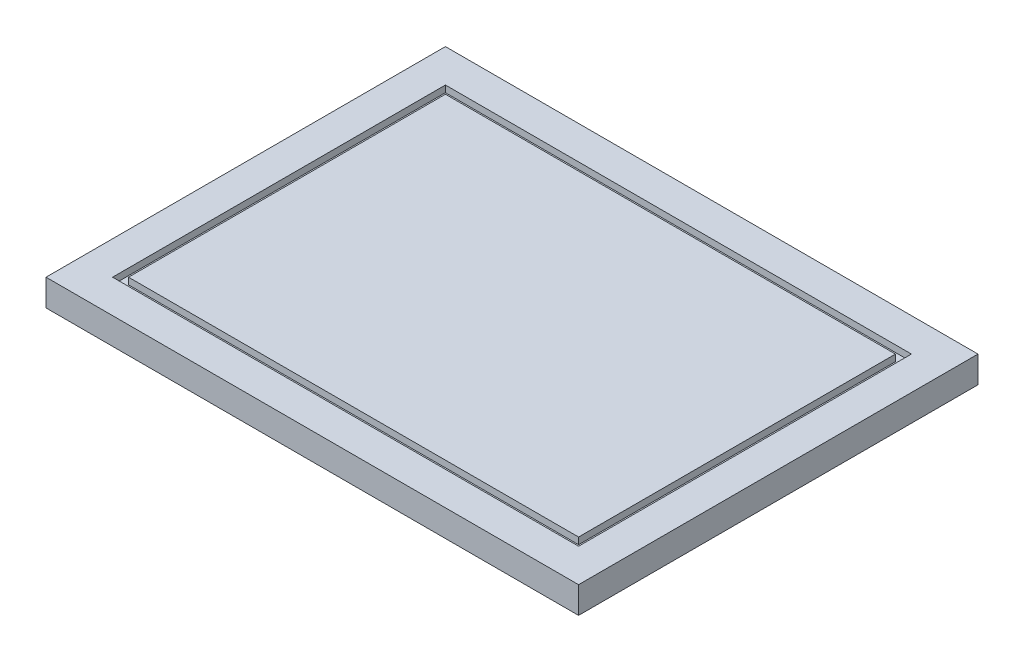
ISO-10303-21;
HEADER;
FILE_DESCRIPTION(('STEP AP214'),'2;1');
FILE_NAME('part.step','',(''),(''),'','','');
FILE_SCHEMA(('AUTOMOTIVE_DESIGN { 1 0 10303 214 1 1 1 1 }'));
ENDSEC;
DATA;
#1=APPLICATION_CONTEXT('core data for automotive mechanical design processes');
#2=APPLICATION_PROTOCOL_DEFINITION('international standard','automotive_design',2000,#1);
#3=PRODUCT_CONTEXT('',#1,'mechanical');
#4=PRODUCT('Part','Part','',(#3));
#5=PRODUCT_RELATED_PRODUCT_CATEGORY('part','',(#4));
#6=PRODUCT_DEFINITION_FORMATION('','',#4);
#7=PRODUCT_DEFINITION_CONTEXT('part definition',#1,'design');
#8=PRODUCT_DEFINITION('design','',#6,#7);
#9=PRODUCT_DEFINITION_SHAPE('','',#8);
#10=(LENGTH_UNIT() NAMED_UNIT(*) SI_UNIT(.MILLI.,.METRE.));
#11=(NAMED_UNIT(*) PLANE_ANGLE_UNIT() SI_UNIT($,.RADIAN.));
#12=(NAMED_UNIT(*) SI_UNIT($,.STERADIAN.) SOLID_ANGLE_UNIT());
#13=UNCERTAINTY_MEASURE_WITH_UNIT(LENGTH_MEASURE(1.E-05),#10,'distance_accuracy_value','');
#14=(GEOMETRIC_REPRESENTATION_CONTEXT(3) GLOBAL_UNCERTAINTY_ASSIGNED_CONTEXT((#13)) GLOBAL_UNIT_ASSIGNED_CONTEXT((#10,
#11,#12)) REPRESENTATION_CONTEXT('',''));
#15=CARTESIAN_POINT('',(0.,0.,0.));
#16=DIRECTION('',(0.,0.,1.));
#17=DIRECTION('',(1.,0.,0.));
#18=AXIS2_PLACEMENT_3D('',#15,#16,#17);
#19=CARTESIAN_POINT('',(0.,20.,0.));
#20=DIRECTION('',(1.,0.,0.));
#21=DIRECTION('',(0.,0.,-1.));
#22=AXIS2_PLACEMENT_3D('',#19,#20,#21);
#23=PLANE('',#22);
#24=DIRECTION('',(0.,0.,1.));
#25=VECTOR('',#24,1.);
#26=CARTESIAN_POINT('',(0.,0.,0.));
#27=LINE('',#26,#25);
#28=CARTESIAN_POINT('',(0.,0.,-300.));
#29=VERTEX_POINT('',#28);
#30=CARTESIAN_POINT('',(0.,0.,0.));
#31=VERTEX_POINT('',#30);
#32=EDGE_CURVE('E189',#29,#31,#27,.T.);
#33=ORIENTED_EDGE('',*,*,#32,.T.);
#34=DIRECTION('',(0.,-1.,0.));
#35=VECTOR('',#34,1.);
#36=CARTESIAN_POINT('',(0.,20.,0.));
#37=LINE('',#36,#35);
#38=CARTESIAN_POINT('',(0.,20.,0.));
#39=VERTEX_POINT('',#38);
#40=EDGE_CURVE('E12',#39,#31,#37,.T.);
#41=ORIENTED_EDGE('',*,*,#40,.F.);
#42=DIRECTION('',(0.,0.,1.));
#43=VECTOR('',#42,1.);
#44=CARTESIAN_POINT('',(0.,20.,0.));
#45=LINE('',#44,#43);
#46=CARTESIAN_POINT('',(0.,20.,-300.));
#47=VERTEX_POINT('',#46);
#48=EDGE_CURVE('E194',#47,#39,#45,.T.);
#49=ORIENTED_EDGE('',*,*,#48,.F.);
#50=DIRECTION('',(0.,-1.,0.));
#51=VECTOR('',#50,1.);
#52=CARTESIAN_POINT('',(0.,20.,-300.));
#53=LINE('',#52,#51);
#54=EDGE_CURVE('E206',#47,#29,#53,.T.);
#55=ORIENTED_EDGE('',*,*,#54,.T.);
#56=EDGE_LOOP('',(#33,#41,#49,#55));
#57=FACE_BOUND('',#56,.T.);
#58=ADVANCED_FACE('F35',(#57),#23,.F.);
#59=CARTESIAN_POINT('',(0.,20.,0.));
#60=DIRECTION('',(0.,0.,-1.));
#61=DIRECTION('',(-1.,0.,0.));
#62=AXIS2_PLACEMENT_3D('',#59,#60,#61);
#63=PLANE('',#62);
#64=DIRECTION('',(1.,0.,0.));
#65=VECTOR('',#64,1.);
#66=CARTESIAN_POINT('',(0.,0.,0.));
#67=LINE('',#66,#65);
#68=CARTESIAN_POINT('',(400.,0.,0.));
#69=VERTEX_POINT('',#68);
#70=EDGE_CURVE('E209',#31,#69,#67,.T.);
#71=ORIENTED_EDGE('',*,*,#70,.T.);
#72=DIRECTION('',(0.,-1.,0.));
#73=VECTOR('',#72,1.);
#74=CARTESIAN_POINT('',(400.,20.,0.));
#75=LINE('',#74,#73);
#76=CARTESIAN_POINT('',(400.,20.,0.));
#77=VERTEX_POINT('',#76);
#78=EDGE_CURVE('E42',#77,#69,#75,.T.);
#79=ORIENTED_EDGE('',*,*,#78,.F.);
#80=DIRECTION('',(1.,0.,0.));
#81=VECTOR('',#80,1.);
#82=CARTESIAN_POINT('',(0.,20.,0.));
#83=LINE('',#82,#81);
#84=EDGE_CURVE('E198',#39,#77,#83,.T.);
#85=ORIENTED_EDGE('',*,*,#84,.F.);
#86=ORIENTED_EDGE('',*,*,#40,.T.);
#87=EDGE_LOOP('',(#71,#79,#85,#86));
#88=FACE_BOUND('',#87,.T.);
#89=ADVANCED_FACE('F239',(#88),#63,.F.);
#90=CARTESIAN_POINT('',(400.,20.,0.));
#91=DIRECTION('',(-1.,0.,0.));
#92=DIRECTION('',(0.,0.,1.));
#93=AXIS2_PLACEMENT_3D('',#90,#91,#92);
#94=PLANE('',#93);
#95=DIRECTION('',(0.,0.,-1.));
#96=VECTOR('',#95,1.);
#97=CARTESIAN_POINT('',(400.,0.,0.));
#98=LINE('',#97,#96);
#99=CARTESIAN_POINT('',(400.,0.,-300.));
#100=VERTEX_POINT('',#99);
#101=EDGE_CURVE('E211',#69,#100,#98,.T.);
#102=ORIENTED_EDGE('',*,*,#101,.T.);
#103=DIRECTION('',(0.,-1.,0.));
#104=VECTOR('',#103,1.);
#105=CARTESIAN_POINT('',(400.,20.,-300.));
#106=LINE('',#105,#104);
#107=CARTESIAN_POINT('',(400.,20.,-300.));
#108=VERTEX_POINT('',#107);
#109=EDGE_CURVE('E216',#108,#100,#106,.T.);
#110=ORIENTED_EDGE('',*,*,#109,.F.);
#111=DIRECTION('',(0.,0.,-1.));
#112=VECTOR('',#111,1.);
#113=CARTESIAN_POINT('',(400.,20.,0.));
#114=LINE('',#113,#112);
#115=EDGE_CURVE('E202',#77,#108,#114,.T.);
#116=ORIENTED_EDGE('',*,*,#115,.F.);
#117=ORIENTED_EDGE('',*,*,#78,.T.);
#118=EDGE_LOOP('',(#102,#110,#116,#117));
#119=FACE_BOUND('',#118,.T.);
#120=ADVANCED_FACE('F223',(#119),#94,.F.);
#121=CARTESIAN_POINT('',(0.,20.,-300.));
#122=DIRECTION('',(0.,0.,1.));
#123=DIRECTION('',(1.,0.,0.));
#124=AXIS2_PLACEMENT_3D('',#121,#122,#123);
#125=PLANE('',#124);
#126=DIRECTION('',(-1.,0.,0.));
#127=VECTOR('',#126,1.);
#128=CARTESIAN_POINT('',(0.,0.,-300.));
#129=LINE('',#128,#127);
#130=EDGE_CURVE('E199',#100,#29,#129,.T.);
#131=ORIENTED_EDGE('',*,*,#130,.T.);
#132=ORIENTED_EDGE('',*,*,#54,.F.);
#133=DIRECTION('',(-1.,0.,0.));
#134=VECTOR('',#133,1.);
#135=CARTESIAN_POINT('',(0.,20.,-300.));
#136=LINE('',#135,#134);
#137=EDGE_CURVE('E204',#108,#47,#136,.T.);
#138=ORIENTED_EDGE('',*,*,#137,.F.);
#139=ORIENTED_EDGE('',*,*,#109,.T.);
#140=EDGE_LOOP('',(#131,#132,#138,#139));
#141=FACE_BOUND('',#140,.T.);
#142=ADVANCED_FACE('F232',(#141),#125,.F.);
#143=CARTESIAN_POINT('',(0.,20.,0.));
#144=DIRECTION('',(0.,-1.,0.));
#145=DIRECTION('',(0.,0.,-1.));
#146=AXIS2_PLACEMENT_3D('',#143,#144,#145);
#147=PLANE('',#146);
#148=DIRECTION('',(0.,0.,1.));
#149=VECTOR('',#148,1.);
#150=CARTESIAN_POINT('',(25.,20.,-275.));
#151=LINE('',#150,#149);
#152=CARTESIAN_POINT('',(25.,20.,-275.));
#153=VERTEX_POINT('',#152);
#154=CARTESIAN_POINT('',(25.0000000000001,20.,-24.9999999999999));
#155=VERTEX_POINT('',#154);
#156=EDGE_CURVE('E179',#153,#155,#151,.T.);
#157=ORIENTED_EDGE('',*,*,#156,.F.);
#158=DIRECTION('',(-1.,0.,0.));
#159=VECTOR('',#158,1.);
#160=CARTESIAN_POINT('',(375.,20.,-275.));
#161=LINE('',#160,#159);
#162=CARTESIAN_POINT('',(375.,20.,-275.));
#163=VERTEX_POINT('',#162);
#164=EDGE_CURVE('E49',#163,#153,#161,.T.);
#165=ORIENTED_EDGE('',*,*,#164,.F.);
#166=DIRECTION('',(0.,0.,-1.));
#167=VECTOR('',#166,1.);
#168=CARTESIAN_POINT('',(375.,20.,-24.9999999999999));
#169=LINE('',#168,#167);
#170=CARTESIAN_POINT('',(375.,20.,-24.9999999999999));
#171=VERTEX_POINT('',#170);
#172=EDGE_CURVE('E168',#171,#163,#169,.T.);
#173=ORIENTED_EDGE('',*,*,#172,.F.);
#174=DIRECTION('',(1.,0.,0.));
#175=VECTOR('',#174,1.);
#176=CARTESIAN_POINT('',(25.0000000000001,20.,-24.9999999999999));
#177=LINE('',#176,#175);
#178=EDGE_CURVE('E182',#155,#171,#177,.T.);
#179=ORIENTED_EDGE('',*,*,#178,.F.);
#180=EDGE_LOOP('',(#157,#165,#173,#179));
#181=FACE_BOUND('',#180,.T.);
#182=ORIENTED_EDGE('',*,*,#48,.T.);
#183=ORIENTED_EDGE('',*,*,#84,.T.);
#184=ORIENTED_EDGE('',*,*,#115,.T.);
#185=ORIENTED_EDGE('',*,*,#137,.T.);
#186=EDGE_LOOP('',(#182,#183,#184,#185));
#187=FACE_BOUND('',#186,.T.);
#188=ADVANCED_FACE('F238',(#181,#187),#147,.F.);
#189=CARTESIAN_POINT('',(0.,0.,0.));
#190=DIRECTION('',(0.,-1.,0.));
#191=DIRECTION('',(0.,0.,-1.));
#192=AXIS2_PLACEMENT_3D('',#189,#190,#191);
#193=PLANE('',#192);
#194=ORIENTED_EDGE('',*,*,#32,.F.);
#195=ORIENTED_EDGE('',*,*,#130,.F.);
#196=ORIENTED_EDGE('',*,*,#101,.F.);
#197=ORIENTED_EDGE('',*,*,#70,.F.);
#198=EDGE_LOOP('',(#194,#195,#196,#197));
#199=FACE_BOUND('',#198,.T.);
#200=ADVANCED_FACE('F229',(#199),#193,.T.);
#201=CARTESIAN_POINT('',(375.,15.,-275.));
#202=DIRECTION('',(0.,0.,-1.));
#203=DIRECTION('',(-1.,0.,0.));
#204=AXIS2_PLACEMENT_3D('',#201,#202,#203);
#205=PLANE('',#204);
#206=ORIENTED_EDGE('',*,*,#164,.T.);
#207=DIRECTION('',(0.,1.,0.));
#208=VECTOR('',#207,1.);
#209=CARTESIAN_POINT('',(25.,15.,-275.));
#210=LINE('',#209,#208);
#211=CARTESIAN_POINT('',(25.,15.,-275.));
#212=VERTEX_POINT('',#211);
#213=EDGE_CURVE('E177',#212,#153,#210,.T.);
#214=ORIENTED_EDGE('',*,*,#213,.F.);
#215=DIRECTION('',(-1.,0.,0.));
#216=VECTOR('',#215,1.);
#217=CARTESIAN_POINT('',(375.,15.,-275.));
#218=LINE('',#217,#216);
#219=CARTESIAN_POINT('',(375.,15.,-275.));
#220=VERTEX_POINT('',#219);
#221=EDGE_CURVE('E164',#220,#212,#218,.T.);
#222=ORIENTED_EDGE('',*,*,#221,.F.);
#223=DIRECTION('',(0.,1.,0.));
#224=VECTOR('',#223,1.);
#225=CARTESIAN_POINT('',(375.,15.,-275.));
#226=LINE('',#225,#224);
#227=EDGE_CURVE('E187',#220,#163,#226,.T.);
#228=ORIENTED_EDGE('',*,*,#227,.T.);
#229=EDGE_LOOP('',(#206,#214,#222,#228));
#230=FACE_BOUND('',#229,.T.);
#231=ADVANCED_FACE('F251',(#230),#205,.F.);
#232=CARTESIAN_POINT('',(375.,15.,-24.9999999999999));
#233=DIRECTION('',(1.,0.,0.));
#234=DIRECTION('',(0.,0.,-1.));
#235=AXIS2_PLACEMENT_3D('',#232,#233,#234);
#236=PLANE('',#235);
#237=ORIENTED_EDGE('',*,*,#172,.T.);
#238=ORIENTED_EDGE('',*,*,#227,.F.);
#239=DIRECTION('',(0.,0.,-1.));
#240=VECTOR('',#239,1.);
#241=CARTESIAN_POINT('',(375.,15.,-24.9999999999999));
#242=LINE('',#241,#240);
#243=CARTESIAN_POINT('',(375.,15.,-24.9999999999999));
#244=VERTEX_POINT('',#243);
#245=EDGE_CURVE('E174',#244,#220,#242,.T.);
#246=ORIENTED_EDGE('',*,*,#245,.F.);
#247=DIRECTION('',(0.,1.,0.));
#248=VECTOR('',#247,1.);
#249=CARTESIAN_POINT('',(375.,15.,-24.9999999999999));
#250=LINE('',#249,#248);
#251=EDGE_CURVE('E190',#244,#171,#250,.T.);
#252=ORIENTED_EDGE('',*,*,#251,.T.);
#253=EDGE_LOOP('',(#237,#238,#246,#252));
#254=FACE_BOUND('',#253,.T.);
#255=ADVANCED_FACE('F258',(#254),#236,.F.);
#256=CARTESIAN_POINT('',(25.0000000000001,15.,-24.9999999999999));
#257=DIRECTION('',(0.,0.,1.));
#258=DIRECTION('',(1.,0.,0.));
#259=AXIS2_PLACEMENT_3D('',#256,#257,#258);
#260=PLANE('',#259);
#261=ORIENTED_EDGE('',*,*,#178,.T.);
#262=ORIENTED_EDGE('',*,*,#251,.F.);
#263=DIRECTION('',(1.,0.,0.));
#264=VECTOR('',#263,1.);
#265=CARTESIAN_POINT('',(25.0000000000001,15.,-24.9999999999999));
#266=LINE('',#265,#264);
#267=CARTESIAN_POINT('',(25.0000000000001,15.,-24.9999999999999));
#268=VERTEX_POINT('',#267);
#269=EDGE_CURVE('E171',#268,#244,#266,.T.);
#270=ORIENTED_EDGE('',*,*,#269,.F.);
#271=DIRECTION('',(0.,1.,0.));
#272=VECTOR('',#271,1.);
#273=CARTESIAN_POINT('',(25.0000000000001,15.,-24.9999999999999));
#274=LINE('',#273,#272);
#275=EDGE_CURVE('E192',#268,#155,#274,.T.);
#276=ORIENTED_EDGE('',*,*,#275,.T.);
#277=EDGE_LOOP('',(#261,#262,#270,#276));
#278=FACE_BOUND('',#277,.T.);
#279=ADVANCED_FACE('F262',(#278),#260,.F.);
#280=CARTESIAN_POINT('',(25.,15.,-275.));
#281=DIRECTION('',(-1.,0.,0.));
#282=DIRECTION('',(0.,0.,1.));
#283=AXIS2_PLACEMENT_3D('',#280,#281,#282);
#284=PLANE('',#283);
#285=ORIENTED_EDGE('',*,*,#156,.T.);
#286=ORIENTED_EDGE('',*,*,#275,.F.);
#287=DIRECTION('',(0.,0.,1.));
#288=VECTOR('',#287,1.);
#289=CARTESIAN_POINT('',(25.,15.,-275.));
#290=LINE('',#289,#288);
#291=EDGE_CURVE('E167',#212,#268,#290,.T.);
#292=ORIENTED_EDGE('',*,*,#291,.F.);
#293=ORIENTED_EDGE('',*,*,#213,.T.);
#294=EDGE_LOOP('',(#285,#286,#292,#293));
#295=FACE_BOUND('',#294,.T.);
#296=ADVANCED_FACE('F259',(#295),#284,.F.);
#297=CARTESIAN_POINT('',(0.,15.,0.));
#298=DIRECTION('',(0.,1.,0.));
#299=DIRECTION('',(0.,0.,1.));
#300=AXIS2_PLACEMENT_3D('',#297,#298,#299);
#301=PLANE('',#300);
#302=DIRECTION('',(-1.,0.,0.));
#303=VECTOR('',#302,1.);
#304=CARTESIAN_POINT('',(31.,15.,-269.));
#305=LINE('',#304,#303);
#306=CARTESIAN_POINT('',(369.,15.,-269.));
#307=VERTEX_POINT('',#306);
#308=CARTESIAN_POINT('',(31.,15.,-269.));
#309=VERTEX_POINT('',#308);
#310=EDGE_CURVE('E135',#307,#309,#305,.T.);
#311=ORIENTED_EDGE('',*,*,#310,.F.);
#312=DIRECTION('',(0.,0.,-1.));
#313=VECTOR('',#312,1.);
#314=CARTESIAN_POINT('',(369.,15.,-269.));
#315=LINE('',#314,#313);
#316=CARTESIAN_POINT('',(369.,15.,-30.9999999999999));
#317=VERTEX_POINT('',#316);
#318=EDGE_CURVE('E145',#317,#307,#315,.T.);
#319=ORIENTED_EDGE('',*,*,#318,.F.);
#320=DIRECTION('',(1.,0.,0.));
#321=VECTOR('',#320,1.);
#322=CARTESIAN_POINT('',(31.0000000000001,15.,-30.9999999999999));
#323=LINE('',#322,#321);
#324=CARTESIAN_POINT('',(31.0000000000001,15.,-30.9999999999999));
#325=VERTEX_POINT('',#324);
#326=EDGE_CURVE('E127',#325,#317,#323,.T.);
#327=ORIENTED_EDGE('',*,*,#326,.F.);
#328=DIRECTION('',(0.,0.,1.));
#329=VECTOR('',#328,1.);
#330=CARTESIAN_POINT('',(31.,15.,-269.));
#331=LINE('',#330,#329);
#332=EDGE_CURVE('E142',#309,#325,#331,.T.);
#333=ORIENTED_EDGE('',*,*,#332,.F.);
#334=EDGE_LOOP('',(#311,#319,#327,#333));
#335=FACE_BOUND('',#334,.T.);
#336=ORIENTED_EDGE('',*,*,#221,.T.);
#337=ORIENTED_EDGE('',*,*,#291,.T.);
#338=ORIENTED_EDGE('',*,*,#269,.T.);
#339=ORIENTED_EDGE('',*,*,#245,.T.);
#340=EDGE_LOOP('',(#336,#337,#338,#339));
#341=FACE_BOUND('',#340,.T.);
#342=ADVANCED_FACE('F140',(#335,#341),#301,.T.);
#343=CARTESIAN_POINT('',(31.,15.,-269.));
#344=DIRECTION('',(-1.,0.,0.));
#345=DIRECTION('',(0.,0.,1.));
#346=AXIS2_PLACEMENT_3D('',#343,#344,#345);
#347=PLANE('',#346);
#348=DIRECTION('',(0.,0.,1.));
#349=VECTOR('',#348,1.);
#350=CARTESIAN_POINT('',(31.,20.,-269.));
#351=LINE('',#350,#349);
#352=CARTESIAN_POINT('',(31.,20.,-269.));
#353=VERTEX_POINT('',#352);
#354=CARTESIAN_POINT('',(31.0000000000001,20.,-30.9999999999999));
#355=VERTEX_POINT('',#354);
#356=EDGE_CURVE('E156',#353,#355,#351,.T.);
#357=ORIENTED_EDGE('',*,*,#356,.F.);
#358=DIRECTION('',(0.,1.,0.));
#359=VECTOR('',#358,1.);
#360=CARTESIAN_POINT('',(31.,15.,-269.));
#361=LINE('',#360,#359);
#362=EDGE_CURVE('E148',#309,#353,#361,.T.);
#363=ORIENTED_EDGE('',*,*,#362,.F.);
#364=ORIENTED_EDGE('',*,*,#332,.T.);
#365=DIRECTION('',(0.,1.,0.));
#366=VECTOR('',#365,1.);
#367=CARTESIAN_POINT('',(31.0000000000001,15.,-30.9999999999999));
#368=LINE('',#367,#366);
#369=EDGE_CURVE('E124',#325,#355,#368,.T.);
#370=ORIENTED_EDGE('',*,*,#369,.T.);
#371=EDGE_LOOP('',(#357,#363,#364,#370));
#372=FACE_BOUND('',#371,.T.);
#373=ADVANCED_FACE('F147',(#372),#347,.T.);
#374=CARTESIAN_POINT('',(31.,15.,-269.));
#375=DIRECTION('',(0.,0.,-1.));
#376=DIRECTION('',(-1.,0.,0.));
#377=AXIS2_PLACEMENT_3D('',#374,#375,#376);
#378=PLANE('',#377);
#379=DIRECTION('',(-1.,0.,0.));
#380=VECTOR('',#379,1.);
#381=CARTESIAN_POINT('',(31.,20.,-269.));
#382=LINE('',#381,#380);
#383=CARTESIAN_POINT('',(369.,20.,-269.));
#384=VERTEX_POINT('',#383);
#385=EDGE_CURVE('E149',#384,#353,#382,.T.);
#386=ORIENTED_EDGE('',*,*,#385,.F.);
#387=DIRECTION('',(0.,1.,0.));
#388=VECTOR('',#387,1.);
#389=CARTESIAN_POINT('',(369.,15.,-269.));
#390=LINE('',#389,#388);
#391=EDGE_CURVE('E161',#307,#384,#390,.T.);
#392=ORIENTED_EDGE('',*,*,#391,.F.);
#393=ORIENTED_EDGE('',*,*,#310,.T.);
#394=ORIENTED_EDGE('',*,*,#362,.T.);
#395=EDGE_LOOP('',(#386,#392,#393,#394));
#396=FACE_BOUND('',#395,.T.);
#397=ADVANCED_FACE('F274',(#396),#378,.T.);
#398=CARTESIAN_POINT('',(369.,15.,-269.));
#399=DIRECTION('',(1.,0.,0.));
#400=DIRECTION('',(0.,0.,-1.));
#401=AXIS2_PLACEMENT_3D('',#398,#399,#400);
#402=PLANE('',#401);
#403=DIRECTION('',(0.,0.,-1.));
#404=VECTOR('',#403,1.);
#405=CARTESIAN_POINT('',(369.,20.,-269.));
#406=LINE('',#405,#404);
#407=CARTESIAN_POINT('',(369.,20.,-30.9999999999999));
#408=VERTEX_POINT('',#407);
#409=EDGE_CURVE('E57',#408,#384,#406,.T.);
#410=ORIENTED_EDGE('',*,*,#409,.F.);
#411=DIRECTION('',(0.,1.,0.));
#412=VECTOR('',#411,1.);
#413=CARTESIAN_POINT('',(369.,15.,-30.9999999999999));
#414=LINE('',#413,#412);
#415=EDGE_CURVE('E134',#317,#408,#414,.T.);
#416=ORIENTED_EDGE('',*,*,#415,.F.);
#417=ORIENTED_EDGE('',*,*,#318,.T.);
#418=ORIENTED_EDGE('',*,*,#391,.T.);
#419=EDGE_LOOP('',(#410,#416,#417,#418));
#420=FACE_BOUND('',#419,.T.);
#421=ADVANCED_FACE('F277',(#420),#402,.T.);
#422=CARTESIAN_POINT('',(31.0000000000001,15.,-30.9999999999999));
#423=DIRECTION('',(0.,0.,1.));
#424=DIRECTION('',(1.,0.,0.));
#425=AXIS2_PLACEMENT_3D('',#422,#423,#424);
#426=PLANE('',#425);
#427=DIRECTION('',(1.,0.,0.));
#428=VECTOR('',#427,1.);
#429=CARTESIAN_POINT('',(31.0000000000001,20.,-30.9999999999999));
#430=LINE('',#429,#428);
#431=EDGE_CURVE('E129',#355,#408,#430,.T.);
#432=ORIENTED_EDGE('',*,*,#431,.F.);
#433=ORIENTED_EDGE('',*,*,#369,.F.);
#434=ORIENTED_EDGE('',*,*,#326,.T.);
#435=ORIENTED_EDGE('',*,*,#415,.T.);
#436=EDGE_LOOP('',(#432,#433,#434,#435));
#437=FACE_BOUND('',#436,.T.);
#438=ADVANCED_FACE('F126',(#437),#426,.T.);
#439=ORIENTED_EDGE('',*,*,#356,.T.);
#440=ORIENTED_EDGE('',*,*,#431,.T.);
#441=ORIENTED_EDGE('',*,*,#409,.T.);
#442=ORIENTED_EDGE('',*,*,#385,.T.);
#443=EDGE_LOOP('',(#439,#440,#441,#442));
#444=FACE_BOUND('',#443,.T.);
#445=ADVANCED_FACE('F255',(#444),#147,.F.);
#446=CLOSED_SHELL('',(#58,#89,#120,#142,#188,#200,#231,#255,#279,#296,#342,#373,#397,#421,#438,#445));
#447=MANIFOLD_SOLID_BREP('B2',#446);
#448=ADVANCED_BREP_SHAPE_REPRESENTATION('',(#18,#447),#14);
#449=SHAPE_DEFINITION_REPRESENTATION(#9,#448);
ENDSEC;
END-ISO-10303-21;
